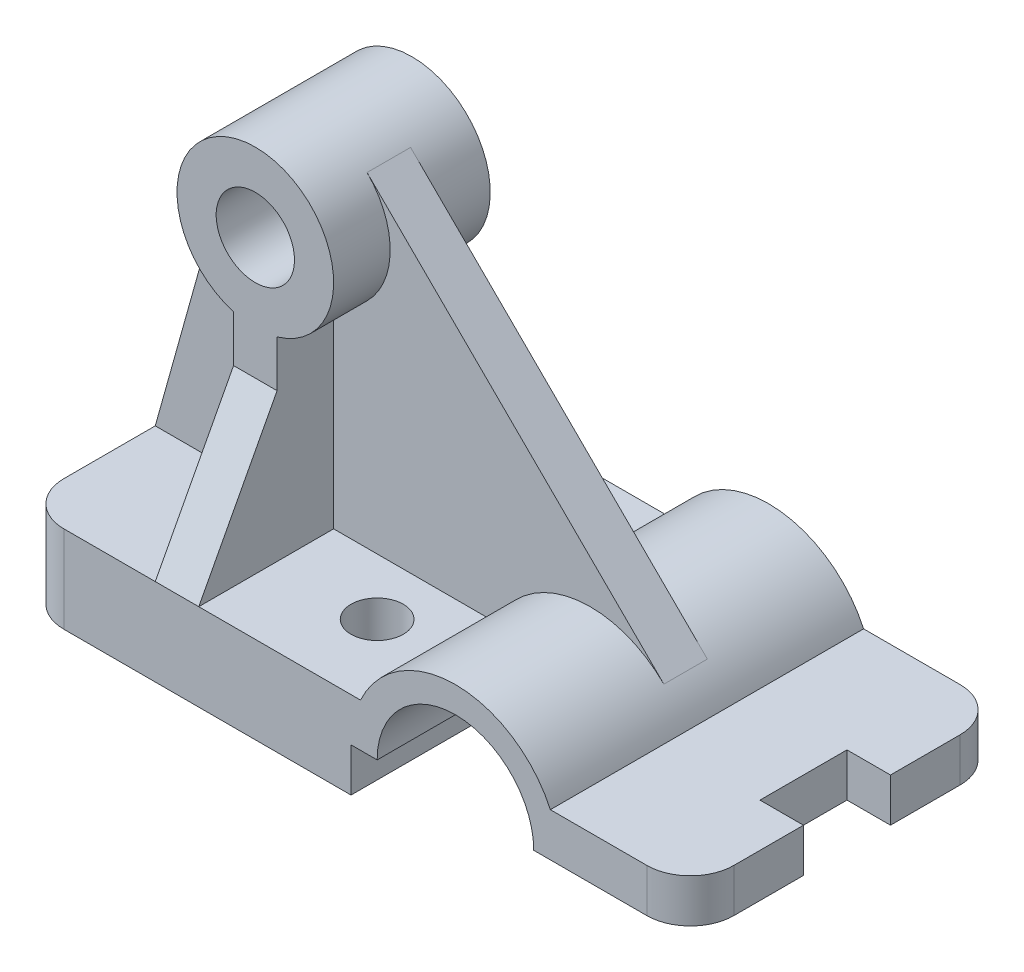
ISO-10303-21;
HEADER;
FILE_DESCRIPTION(('STEP AP214'),'2;1');
FILE_NAME('part.step','',(''),(''),'','','');
FILE_SCHEMA(('AUTOMOTIVE_DESIGN { 1 0 10303 214 1 1 1 1 }'));
ENDSEC;
DATA;
#1=APPLICATION_CONTEXT('core data for automotive mechanical design processes');
#2=APPLICATION_PROTOCOL_DEFINITION('international standard','automotive_design',2000,#1);
#3=PRODUCT_CONTEXT('',#1,'mechanical');
#4=PRODUCT('Part','Part','',(#3));
#5=PRODUCT_RELATED_PRODUCT_CATEGORY('part','',(#4));
#6=PRODUCT_DEFINITION_FORMATION('','',#4);
#7=PRODUCT_DEFINITION_CONTEXT('part definition',#1,'design');
#8=PRODUCT_DEFINITION('design','',#6,#7);
#9=PRODUCT_DEFINITION_SHAPE('','',#8);
#10=(LENGTH_UNIT() NAMED_UNIT(*) SI_UNIT(.MILLI.,.METRE.));
#11=(NAMED_UNIT(*) PLANE_ANGLE_UNIT() SI_UNIT($,.RADIAN.));
#12=(NAMED_UNIT(*) SI_UNIT($,.STERADIAN.) SOLID_ANGLE_UNIT());
#13=UNCERTAINTY_MEASURE_WITH_UNIT(LENGTH_MEASURE(1.E-05),#10,'distance_accuracy_value','');
#14=(GEOMETRIC_REPRESENTATION_CONTEXT(3) GLOBAL_UNCERTAINTY_ASSIGNED_CONTEXT((#13)) GLOBAL_UNIT_ASSIGNED_CONTEXT((#10,
#11,#12)) REPRESENTATION_CONTEXT('',''));
#15=CARTESIAN_POINT('',(0.,0.,0.));
#16=DIRECTION('',(0.,0.,1.));
#17=DIRECTION('',(1.,0.,0.));
#18=AXIS2_PLACEMENT_3D('',#15,#16,#17);
#19=CARTESIAN_POINT('',(31.,0.,0.));
#20=DIRECTION('',(1.,0.,0.));
#21=DIRECTION('',(0.,0.,-1.));
#22=AXIS2_PLACEMENT_3D('',#19,#20,#21);
#23=PLANE('',#22);
#24=DIRECTION('',(0.,-1.,0.));
#25=VECTOR('',#24,1.);
#26=CARTESIAN_POINT('',(31.,0.,31.));
#27=LINE('',#26,#25);
#28=CARTESIAN_POINT('',(31.,64.7083835342094,31.));
#29=VERTEX_POINT('',#28);
#30=CARTESIAN_POINT('',(31.,20.,31.));
#31=VERTEX_POINT('',#30);
#32=EDGE_CURVE('E264',#29,#31,#27,.T.);
#33=ORIENTED_EDGE('',*,*,#32,.F.);
#34=DIRECTION('',(0.,0.,-1.));
#35=VECTOR('',#34,1.);
#36=CARTESIAN_POINT('',(31.,64.7083835342094,54.));
#37=LINE('',#36,#35);
#38=CARTESIAN_POINT('',(31.,64.7083835342094,18.));
#39=VERTEX_POINT('',#38);
#40=EDGE_CURVE('E249',#39,#29,#37,.F.);
#41=ORIENTED_EDGE('',*,*,#40,.F.);
#42=DIRECTION('',(0.,1.,0.));
#43=VECTOR('',#42,1.);
#44=CARTESIAN_POINT('',(31.,54.,18.));
#45=LINE('',#44,#43);
#46=CARTESIAN_POINT('',(31.,54.,18.));
#47=VERTEX_POINT('',#46);
#48=EDGE_CURVE('E354',#47,#39,#45,.T.);
#49=ORIENTED_EDGE('',*,*,#48,.F.);
#50=DIRECTION('',(0.,-0.883787916347062,-0.467887720419033));
#51=VECTOR('',#50,1.);
#52=CARTESIAN_POINT('',(31.,54.,18.));
#53=LINE('',#52,#51);
#54=CARTESIAN_POINT('',(31.,20.,0.));
#55=VERTEX_POINT('',#54);
#56=EDGE_CURVE('E352',#47,#55,#53,.T.);
#57=ORIENTED_EDGE('',*,*,#56,.T.);
#58=DIRECTION('',(0.,0.,-1.));
#59=VECTOR('',#58,1.);
#60=CARTESIAN_POINT('',(31.,20.,72.));
#61=LINE('',#60,#59);
#62=EDGE_CURVE('E266',#31,#55,#61,.T.);
#63=ORIENTED_EDGE('',*,*,#62,.F.);
#64=EDGE_LOOP('',(#33,#41,#49,#57,#63));
#65=FACE_BOUND('',#64,.T.);
#66=ADVANCED_FACE('F33',(#65),#23,.F.);
#67=CARTESIAN_POINT('',(0.,20.,72.));
#68=DIRECTION('',(0.,-1.,0.));
#69=DIRECTION('',(1.,0.,0.));
#70=AXIS2_PLACEMENT_3D('',#67,#68,#69);
#71=PLANE('',#70);
#72=DIRECTION('',(-1.,0.,0.));
#73=VECTOR('',#72,1.);
#74=CARTESIAN_POINT('',(0.,20.,31.));
#75=LINE('',#74,#73);
#76=CARTESIAN_POINT('',(0.,20.,31.));
#77=VERTEX_POINT('',#76);
#78=EDGE_CURVE('E49',#31,#77,#75,.T.);
#79=ORIENTED_EDGE('',*,*,#78,.F.);
#80=ORIENTED_EDGE('',*,*,#62,.T.);
#81=DIRECTION('',(-1.,0.,0.));
#82=VECTOR('',#81,1.);
#83=CARTESIAN_POINT('',(0.,20.,0.));
#84=LINE('',#83,#82);
#85=CARTESIAN_POINT('',(10.,20.,0.));
#86=VERTEX_POINT('',#85);
#87=EDGE_CURVE('E434',#55,#86,#84,.T.);
#88=ORIENTED_EDGE('',*,*,#87,.T.);
#89=CARTESIAN_POINT('',(10.,20.,10.));
#90=DIRECTION('',(0.,-1.,0.));
#91=DIRECTION('',(1.,0.,0.));
#92=AXIS2_PLACEMENT_3D('',#89,#90,#91);
#93=CIRCLE('',#92,10.);
#94=CARTESIAN_POINT('',(0.,20.,10.));
#95=VERTEX_POINT('',#94);
#96=EDGE_CURVE('E498',#86,#95,#93,.F.);
#97=ORIENTED_EDGE('',*,*,#96,.T.);
#98=DIRECTION('',(0.,0.,-1.));
#99=VECTOR('',#98,1.);
#100=CARTESIAN_POINT('',(0.,20.,72.));
#101=LINE('',#100,#99);
#102=EDGE_CURVE('E413',#77,#95,#101,.T.);
#103=ORIENTED_EDGE('',*,*,#102,.F.);
#104=EDGE_LOOP('',(#79,#80,#88,#97,#103));
#105=FACE_BOUND('',#104,.T.);
#106=ADVANCED_FACE('F575',(#105),#71,.F.);
#107=CARTESIAN_POINT('',(41.,0.,0.));
#108=DIRECTION('',(1.,0.,0.));
#109=DIRECTION('',(0.,0.,-1.));
#110=AXIS2_PLACEMENT_3D('',#107,#108,#109);
#111=PLANE('',#110);
#112=DIRECTION('',(0.,0.,-1.));
#113=VECTOR('',#112,1.);
#114=CARTESIAN_POINT('',(41.,64.7083835342094,54.));
#115=LINE('',#114,#113);
#116=CARTESIAN_POINT('',(41.,64.7083835342094,18.));
#117=VERTEX_POINT('',#116);
#118=CARTESIAN_POINT('',(41.,64.7083835342094,31.));
#119=VERTEX_POINT('',#118);
#120=EDGE_CURVE('E327',#117,#119,#115,.F.);
#121=ORIENTED_EDGE('',*,*,#120,.T.);
#122=DIRECTION('',(0.,-1.,0.));
#123=VECTOR('',#122,1.);
#124=CARTESIAN_POINT('',(41.,0.,31.));
#125=LINE('',#124,#123);
#126=CARTESIAN_POINT('',(41.,20.,31.));
#127=VERTEX_POINT('',#126);
#128=EDGE_CURVE('E297',#119,#127,#125,.T.);
#129=ORIENTED_EDGE('',*,*,#128,.T.);
#130=DIRECTION('',(0.,0.,-1.));
#131=VECTOR('',#130,1.);
#132=CARTESIAN_POINT('',(41.,20.,72.));
#133=LINE('',#132,#131);
#134=CARTESIAN_POINT('',(41.,20.,0.));
#135=VERTEX_POINT('',#134);
#136=EDGE_CURVE('E334',#127,#135,#133,.T.);
#137=ORIENTED_EDGE('',*,*,#136,.T.);
#138=DIRECTION('',(0.,-0.883787916347062,-0.467887720419033));
#139=VECTOR('',#138,1.);
#140=CARTESIAN_POINT('',(41.,54.,18.));
#141=LINE('',#140,#139);
#142=CARTESIAN_POINT('',(41.,54.,18.));
#143=VERTEX_POINT('',#142);
#144=EDGE_CURVE('E339',#143,#135,#141,.T.);
#145=ORIENTED_EDGE('',*,*,#144,.F.);
#146=DIRECTION('',(0.,1.,0.));
#147=VECTOR('',#146,1.);
#148=CARTESIAN_POINT('',(41.,54.,18.));
#149=LINE('',#148,#147);
#150=EDGE_CURVE('E342',#143,#117,#149,.T.);
#151=ORIENTED_EDGE('',*,*,#150,.T.);
#152=EDGE_LOOP('',(#121,#129,#137,#145,#151));
#153=FACE_BOUND('',#152,.T.);
#154=ADVANCED_FACE('F586',(#153),#111,.T.);
#155=CARTESIAN_POINT('',(64.,20.,18.));
#156=DIRECTION('',(0.,-1.,0.));
#157=DIRECTION('',(1.,0.,0.));
#158=AXIS2_PLACEMENT_3D('',#155,#156,#157);
#159=CIRCLE('',#158,6.);
#160=CARTESIAN_POINT('',(70.,20.,18.));
#161=VERTEX_POINT('',#160);
#162=EDGE_CURVE('E555',#161,#161,#159,.F.);
#163=ORIENTED_EDGE('',*,*,#162,.F.);
#164=EDGE_LOOP('',(#163));
#165=FACE_BOUND('',#164,.T.);
#166=DIRECTION('',(-1.,0.,0.));
#167=VECTOR('',#166,1.);
#168=CARTESIAN_POINT('',(0.,20.,31.));
#169=LINE('',#168,#167);
#170=CARTESIAN_POINT('',(78.1825757707286,20.,31.));
#171=VERTEX_POINT('',#170);
#172=EDGE_CURVE('E299',#171,#127,#169,.T.);
#173=ORIENTED_EDGE('',*,*,#172,.F.);
#174=DIRECTION('',(0.,0.,-1.));
#175=VECTOR('',#174,1.);
#176=CARTESIAN_POINT('',(78.1825757707286,20.,72.));
#177=LINE('',#176,#175);
#178=CARTESIAN_POINT('',(78.1825757707286,20.,0.));
#179=VERTEX_POINT('',#178);
#180=EDGE_CURVE('E440',#171,#179,#177,.T.);
#181=ORIENTED_EDGE('',*,*,#180,.T.);
#182=EDGE_CURVE('E396',#179,#135,#84,.T.);
#183=ORIENTED_EDGE('',*,*,#182,.T.);
#184=ORIENTED_EDGE('',*,*,#136,.F.);
#185=EDGE_LOOP('',(#173,#181,#183,#184));
#186=FACE_BOUND('',#185,.T.);
#187=ADVANCED_FACE('F587',(#165,#186),#71,.F.);
#188=DIRECTION('',(0.,-1.,0.));
#189=VECTOR('',#188,1.);
#190=CARTESIAN_POINT('',(41.,0.,41.));
#191=LINE('',#190,#189);
#192=CARTESIAN_POINT('',(41.,64.7083835342094,41.));
#193=VERTEX_POINT('',#192);
#194=CARTESIAN_POINT('',(41.,20.,41.));
#195=VERTEX_POINT('',#194);
#196=EDGE_CURVE('E307',#193,#195,#191,.T.);
#197=ORIENTED_EDGE('',*,*,#196,.F.);
#198=CARTESIAN_POINT('',(41.,64.7083835342094,54.));
#199=VERTEX_POINT('',#198);
#200=EDGE_CURVE('E325',#193,#199,#115,.F.);
#201=ORIENTED_EDGE('',*,*,#200,.T.);
#202=DIRECTION('',(0.,1.,0.));
#203=VECTOR('',#202,1.);
#204=CARTESIAN_POINT('',(41.,54.,54.));
#205=LINE('',#204,#203);
#206=CARTESIAN_POINT('',(41.,54.,54.));
#207=VERTEX_POINT('',#206);
#208=EDGE_CURVE('E344',#207,#199,#205,.T.);
#209=ORIENTED_EDGE('',*,*,#208,.F.);
#210=DIRECTION('',(0.,-0.883787916347062,0.467887720419033));
#211=VECTOR('',#210,1.);
#212=CARTESIAN_POINT('',(41.,54.,54.));
#213=LINE('',#212,#211);
#214=CARTESIAN_POINT('',(41.,20.,72.));
#215=VERTEX_POINT('',#214);
#216=EDGE_CURVE('E331',#207,#215,#213,.T.);
#217=ORIENTED_EDGE('',*,*,#216,.T.);
#218=EDGE_CURVE('E336',#215,#195,#133,.T.);
#219=ORIENTED_EDGE('',*,*,#218,.T.);
#220=EDGE_LOOP('',(#197,#201,#209,#217,#219));
#221=FACE_BOUND('',#220,.T.);
#222=ADVANCED_FACE('F528',(#221),#111,.T.);
#223=CARTESIAN_POINT('',(31.,64.7083835342094,41.));
#224=VERTEX_POINT('',#223);
#225=CARTESIAN_POINT('',(31.,64.7083835342094,54.));
#226=VERTEX_POINT('',#225);
#227=EDGE_CURVE('E261',#224,#226,#37,.F.);
#228=ORIENTED_EDGE('',*,*,#227,.F.);
#229=DIRECTION('',(0.,-1.,0.));
#230=VECTOR('',#229,1.);
#231=CARTESIAN_POINT('',(31.,0.,41.));
#232=LINE('',#231,#230);
#233=CARTESIAN_POINT('',(31.,20.,41.));
#234=VERTEX_POINT('',#233);
#235=EDGE_CURVE('E57',#224,#234,#232,.T.);
#236=ORIENTED_EDGE('',*,*,#235,.T.);
#237=CARTESIAN_POINT('',(31.,20.,72.));
#238=VERTEX_POINT('',#237);
#239=EDGE_CURVE('E350',#238,#234,#61,.T.);
#240=ORIENTED_EDGE('',*,*,#239,.F.);
#241=DIRECTION('',(0.,-0.883787916347062,0.467887720419033));
#242=VECTOR('',#241,1.);
#243=CARTESIAN_POINT('',(31.,54.,54.));
#244=LINE('',#243,#242);
#245=CARTESIAN_POINT('',(31.,54.,54.));
#246=VERTEX_POINT('',#245);
#247=EDGE_CURVE('E330',#246,#238,#244,.T.);
#248=ORIENTED_EDGE('',*,*,#247,.F.);
#249=DIRECTION('',(0.,1.,0.));
#250=VECTOR('',#249,1.);
#251=CARTESIAN_POINT('',(31.,54.,54.));
#252=LINE('',#251,#250);
#253=EDGE_CURVE('E335',#246,#226,#252,.T.);
#254=ORIENTED_EDGE('',*,*,#253,.T.);
#255=EDGE_LOOP('',(#228,#236,#240,#248,#254));
#256=FACE_BOUND('',#255,.T.);
#257=ADVANCED_FACE('F533',(#256),#23,.F.);
#258=ORIENTED_EDGE('',*,*,#239,.T.);
#259=DIRECTION('',(-1.,0.,0.));
#260=VECTOR('',#259,1.);
#261=CARTESIAN_POINT('',(0.,20.,41.));
#262=LINE('',#261,#260);
#263=CARTESIAN_POINT('',(0.,20.,41.));
#264=VERTEX_POINT('',#263);
#265=EDGE_CURVE('E283',#234,#264,#262,.T.);
#266=ORIENTED_EDGE('',*,*,#265,.T.);
#267=CARTESIAN_POINT('',(0.,20.,62.));
#268=VERTEX_POINT('',#267);
#269=EDGE_CURVE('E437',#268,#264,#101,.T.);
#270=ORIENTED_EDGE('',*,*,#269,.F.);
#271=CARTESIAN_POINT('',(9.99999999999999,20.,62.));
#272=DIRECTION('',(0.,-1.,0.));
#273=DIRECTION('',(1.,0.,0.));
#274=AXIS2_PLACEMENT_3D('',#271,#272,#273);
#275=CIRCLE('',#274,10.);
#276=CARTESIAN_POINT('',(9.99999999999999,20.,72.));
#277=VERTEX_POINT('',#276);
#278=EDGE_CURVE('E501',#268,#277,#275,.F.);
#279=ORIENTED_EDGE('',*,*,#278,.T.);
#280=DIRECTION('',(-1.,0.,0.));
#281=VECTOR('',#280,1.);
#282=CARTESIAN_POINT('',(0.,20.,72.));
#283=LINE('',#282,#281);
#284=EDGE_CURVE('E409',#238,#277,#283,.T.);
#285=ORIENTED_EDGE('',*,*,#284,.F.);
#286=EDGE_LOOP('',(#258,#266,#270,#279,#285));
#287=FACE_BOUND('',#286,.T.);
#288=ADVANCED_FACE('F546',(#287),#71,.F.);
#289=CARTESIAN_POINT('',(154.,10.,72.));
#290=DIRECTION('',(-1.,0.,0.));
#291=DIRECTION('',(0.,-1.,0.));
#292=AXIS2_PLACEMENT_3D('',#289,#290,#291);
#293=PLANE('',#292);
#294=DIRECTION('',(0.,0.,-1.));
#295=VECTOR('',#294,1.);
#296=CARTESIAN_POINT('',(154.,10.,72.));
#297=LINE('',#296,#295);
#298=CARTESIAN_POINT('',(154.,10.,62.));
#299=VERTEX_POINT('',#298);
#300=CARTESIAN_POINT('',(154.,10.,46.));
#301=VERTEX_POINT('',#300);
#302=EDGE_CURVE('E451',#299,#301,#297,.T.);
#303=ORIENTED_EDGE('',*,*,#302,.T.);
#304=DIRECTION('',(0.,1.,0.));
#305=VECTOR('',#304,1.);
#306=CARTESIAN_POINT('',(154.,-52.,46.));
#307=LINE('',#306,#305);
#308=CARTESIAN_POINT('',(154.,20.,46.));
#309=VERTEX_POINT('',#308);
#310=EDGE_CURVE('E375',#301,#309,#307,.T.);
#311=ORIENTED_EDGE('',*,*,#310,.T.);
#312=DIRECTION('',(0.,0.,-1.));
#313=VECTOR('',#312,1.);
#314=CARTESIAN_POINT('',(154.,20.,72.));
#315=LINE('',#314,#313);
#316=CARTESIAN_POINT('',(154.,20.,62.));
#317=VERTEX_POINT('',#316);
#318=EDGE_CURVE('E447',#317,#309,#315,.T.);
#319=ORIENTED_EDGE('',*,*,#318,.F.);
#320=DIRECTION('',(0.,1.,0.));
#321=VECTOR('',#320,1.);
#322=CARTESIAN_POINT('',(154.,10.,62.));
#323=LINE('',#322,#321);
#324=EDGE_CURVE('E464',#317,#299,#323,.F.);
#325=ORIENTED_EDGE('',*,*,#324,.T.);
#326=EDGE_LOOP('',(#303,#311,#319,#325));
#327=FACE_BOUND('',#326,.T.);
#328=ADVANCED_FACE('F589',(#327),#293,.F.);
#329=CARTESIAN_POINT('',(0.,0.,72.));
#330=DIRECTION('',(1.,0.,0.));
#331=DIRECTION('',(0.,0.,-1.));
#332=AXIS2_PLACEMENT_3D('',#329,#330,#331);
#333=PLANE('',#332);
#334=ORIENTED_EDGE('',*,*,#269,.T.);
#335=DIRECTION('',(0.,0.,-1.));
#336=VECTOR('',#335,1.);
#337=CARTESIAN_POINT('',(0.,20.,72.));
#338=LINE('',#337,#336);
#339=EDGE_CURVE('E285',#77,#264,#338,.F.);
#340=ORIENTED_EDGE('',*,*,#339,.F.);
#341=ORIENTED_EDGE('',*,*,#102,.T.);
#342=DIRECTION('',(0.,-1.,0.));
#343=VECTOR('',#342,1.);
#344=CARTESIAN_POINT('',(0.,0.,10.));
#345=LINE('',#344,#343);
#346=CARTESIAN_POINT('',(0.,0.,10.));
#347=VERTEX_POINT('',#346);
#348=EDGE_CURVE('E493',#95,#347,#345,.T.);
#349=ORIENTED_EDGE('',*,*,#348,.T.);
#350=DIRECTION('',(0.,0.,-1.));
#351=VECTOR('',#350,1.);
#352=CARTESIAN_POINT('',(0.,0.,72.));
#353=LINE('',#352,#351);
#354=CARTESIAN_POINT('',(0.,0.,62.));
#355=VERTEX_POINT('',#354);
#356=EDGE_CURVE('E462',#355,#347,#353,.T.);
#357=ORIENTED_EDGE('',*,*,#356,.F.);
#358=DIRECTION('',(0.,-1.,0.));
#359=VECTOR('',#358,1.);
#360=CARTESIAN_POINT('',(0.,20.,62.));
#361=LINE('',#360,#359);
#362=EDGE_CURVE('E496',#355,#268,#361,.F.);
#363=ORIENTED_EDGE('',*,*,#362,.T.);
#364=EDGE_LOOP('',(#334,#340,#341,#349,#357,#363));
#365=FACE_BOUND('',#364,.T.);
#366=ADVANCED_FACE('F550',(#365),#333,.F.);
#367=CARTESIAN_POINT('',(0.,0.,72.));
#368=DIRECTION('',(0.,1.,0.));
#369=DIRECTION('',(0.,0.,1.));
#370=AXIS2_PLACEMENT_3D('',#367,#368,#369);
#371=PLANE('',#370);
#372=CARTESIAN_POINT('',(64.,0.,54.));
#373=DIRECTION('',(0.,1.,0.));
#374=DIRECTION('',(0.,0.,1.));
#375=AXIS2_PLACEMENT_3D('',#372,#373,#374);
#376=CIRCLE('',#375,6.);
#377=CARTESIAN_POINT('',(64.,0.,60.));
#378=VERTEX_POINT('',#377);
#379=EDGE_CURVE('E564',#378,#378,#376,.T.);
#380=ORIENTED_EDGE('',*,*,#379,.T.);
#381=EDGE_LOOP('',(#380));
#382=FACE_BOUND('',#381,.T.);
#383=CARTESIAN_POINT('',(64.,0.,18.));
#384=DIRECTION('',(0.,1.,0.));
#385=DIRECTION('',(0.,0.,1.));
#386=AXIS2_PLACEMENT_3D('',#383,#384,#385);
#387=CIRCLE('',#386,6.);
#388=CARTESIAN_POINT('',(64.,0.,24.));
#389=VERTEX_POINT('',#388);
#390=EDGE_CURVE('E557',#389,#389,#387,.T.);
#391=ORIENTED_EDGE('',*,*,#390,.T.);
#392=EDGE_LOOP('',(#391));
#393=FACE_BOUND('',#392,.T.);
#394=ORIENTED_EDGE('',*,*,#356,.T.);
#395=CARTESIAN_POINT('',(10.,0.,10.));
#396=DIRECTION('',(0.,1.,0.));
#397=DIRECTION('',(0.,0.,1.));
#398=AXIS2_PLACEMENT_3D('',#395,#396,#397);
#399=CIRCLE('',#398,10.);
#400=CARTESIAN_POINT('',(10.,0.,0.));
#401=VERTEX_POINT('',#400);
#402=EDGE_CURVE('E489',#347,#401,#399,.F.);
#403=ORIENTED_EDGE('',*,*,#402,.T.);
#404=DIRECTION('',(1.,0.,0.));
#405=VECTOR('',#404,1.);
#406=CARTESIAN_POINT('',(0.,0.,0.));
#407=LINE('',#406,#405);
#408=CARTESIAN_POINT('',(76.,0.,0.));
#409=VERTEX_POINT('',#408);
#410=EDGE_CURVE('E392',#401,#409,#407,.T.);
#411=ORIENTED_EDGE('',*,*,#410,.T.);
#412=DIRECTION('',(0.,0.,-1.));
#413=VECTOR('',#412,1.);
#414=CARTESIAN_POINT('',(76.,0.,72.));
#415=LINE('',#414,#413);
#416=CARTESIAN_POINT('',(76.,0.,72.));
#417=VERTEX_POINT('',#416);
#418=EDGE_CURVE('E460',#417,#409,#415,.T.);
#419=ORIENTED_EDGE('',*,*,#418,.F.);
#420=DIRECTION('',(1.,0.,0.));
#421=VECTOR('',#420,1.);
#422=CARTESIAN_POINT('',(0.,0.,72.));
#423=LINE('',#422,#421);
#424=CARTESIAN_POINT('',(9.99999999999999,0.,72.));
#425=VERTEX_POINT('',#424);
#426=EDGE_CURVE('E393',#425,#417,#423,.T.);
#427=ORIENTED_EDGE('',*,*,#426,.F.);
#428=CARTESIAN_POINT('',(9.99999999999999,0.,62.));
#429=DIRECTION('',(0.,1.,0.));
#430=DIRECTION('',(0.,0.,1.));
#431=AXIS2_PLACEMENT_3D('',#428,#429,#430);
#432=CIRCLE('',#431,10.);
#433=EDGE_CURVE('E491',#425,#355,#432,.F.);
#434=ORIENTED_EDGE('',*,*,#433,.T.);
#435=EDGE_LOOP('',(#394,#403,#411,#419,#427,#434));
#436=FACE_BOUND('',#435,.T.);
#437=ADVANCED_FACE('F838',(#382,#393,#436),#371,.F.);
#438=CARTESIAN_POINT('',(76.,0.,72.));
#439=DIRECTION('',(-1.,0.,0.));
#440=DIRECTION('',(0.,0.,1.));
#441=AXIS2_PLACEMENT_3D('',#438,#439,#440);
#442=PLANE('',#441);
#443=ORIENTED_EDGE('',*,*,#418,.T.);
#444=DIRECTION('',(0.,1.,0.));
#445=VECTOR('',#444,1.);
#446=CARTESIAN_POINT('',(76.,0.,0.));
#447=LINE('',#446,#445);
#448=CARTESIAN_POINT('',(76.,10.,0.));
#449=VERTEX_POINT('',#448);
#450=EDGE_CURVE('E416',#409,#449,#447,.T.);
#451=ORIENTED_EDGE('',*,*,#450,.T.);
#452=DIRECTION('',(0.,0.,-1.));
#453=VECTOR('',#452,1.);
#454=CARTESIAN_POINT('',(76.,10.,72.));
#455=LINE('',#454,#453);
#456=CARTESIAN_POINT('',(76.,10.,72.));
#457=VERTEX_POINT('',#456);
#458=EDGE_CURVE('E458',#457,#449,#455,.T.);
#459=ORIENTED_EDGE('',*,*,#458,.F.);
#460=DIRECTION('',(0.,1.,0.));
#461=VECTOR('',#460,1.);
#462=CARTESIAN_POINT('',(76.,0.,72.));
#463=LINE('',#462,#461);
#464=EDGE_CURVE('E395',#417,#457,#463,.T.);
#465=ORIENTED_EDGE('',*,*,#464,.F.);
#466=EDGE_LOOP('',(#443,#451,#459,#465));
#467=FACE_BOUND('',#466,.T.);
#468=ADVANCED_FACE('F841',(#467),#442,.F.);
#469=CARTESIAN_POINT('',(76.,10.,72.));
#470=DIRECTION('',(0.,1.,0.));
#471=DIRECTION('',(0.,0.,1.));
#472=AXIS2_PLACEMENT_3D('',#469,#470,#471);
#473=PLANE('',#472);
#474=ORIENTED_EDGE('',*,*,#458,.T.);
#475=DIRECTION('',(1.,0.,0.));
#476=VECTOR('',#475,1.);
#477=CARTESIAN_POINT('',(76.,10.,0.));
#478=LINE('',#477,#476);
#479=CARTESIAN_POINT('',(82.,10.,0.));
#480=VERTEX_POINT('',#479);
#481=EDGE_CURVE('E419',#449,#480,#478,.T.);
#482=ORIENTED_EDGE('',*,*,#481,.T.);
#483=DIRECTION('',(0.,0.,-1.));
#484=VECTOR('',#483,1.);
#485=CARTESIAN_POINT('',(82.,10.,72.));
#486=LINE('',#485,#484);
#487=CARTESIAN_POINT('',(82.,10.,72.));
#488=VERTEX_POINT('',#487);
#489=EDGE_CURVE('E456',#488,#480,#486,.T.);
#490=ORIENTED_EDGE('',*,*,#489,.F.);
#491=DIRECTION('',(1.,0.,0.));
#492=VECTOR('',#491,1.);
#493=CARTESIAN_POINT('',(76.,10.,72.));
#494=LINE('',#493,#492);
#495=EDGE_CURVE('E398',#457,#488,#494,.T.);
#496=ORIENTED_EDGE('',*,*,#495,.F.);
#497=EDGE_LOOP('',(#474,#482,#490,#496));
#498=FACE_BOUND('',#497,.T.);
#499=ADVANCED_FACE('F844',(#498),#473,.F.);
#500=CARTESIAN_POINT('',(100.,10.,72.));
#501=DIRECTION('',(0.,0.,-1.));
#502=DIRECTION('',(-1.,0.,0.));
#503=AXIS2_PLACEMENT_3D('',#500,#501,#502);
#504=CYLINDRICAL_SURFACE('',#503,18.);
#505=ORIENTED_EDGE('',*,*,#489,.T.);
#506=CARTESIAN_POINT('',(100.,10.,0.));
#507=DIRECTION('',(0.,0.,-1.));
#508=DIRECTION('',(-1.,0.,0.));
#509=AXIS2_PLACEMENT_3D('',#506,#507,#508);
#510=CIRCLE('',#509,18.);
#511=CARTESIAN_POINT('',(118.,10.,0.));
#512=VERTEX_POINT('',#511);
#513=EDGE_CURVE('E422',#480,#512,#510,.T.);
#514=ORIENTED_EDGE('',*,*,#513,.T.);
#515=DIRECTION('',(0.,0.,-1.));
#516=VECTOR('',#515,1.);
#517=CARTESIAN_POINT('',(118.,10.,72.));
#518=LINE('',#517,#516);
#519=CARTESIAN_POINT('',(118.,10.,72.));
#520=VERTEX_POINT('',#519);
#521=EDGE_CURVE('E454',#520,#512,#518,.T.);
#522=ORIENTED_EDGE('',*,*,#521,.F.);
#523=CARTESIAN_POINT('',(100.,10.,72.));
#524=DIRECTION('',(0.,0.,-1.));
#525=DIRECTION('',(-1.,0.,0.));
#526=AXIS2_PLACEMENT_3D('',#523,#524,#525);
#527=CIRCLE('',#526,18.);
#528=EDGE_CURVE('E400',#488,#520,#527,.T.);
#529=ORIENTED_EDGE('',*,*,#528,.F.);
#530=EDGE_LOOP('',(#505,#514,#522,#529));
#531=FACE_BOUND('',#530,.T.);
#532=ADVANCED_FACE('F848',(#531),#504,.F.);
#533=CARTESIAN_POINT('',(118.,10.,72.));
#534=DIRECTION('',(0.,1.,0.));
#535=DIRECTION('',(-1.,0.,0.));
#536=AXIS2_PLACEMENT_3D('',#533,#534,#535);
#537=PLANE('',#536);
#538=ORIENTED_EDGE('',*,*,#521,.T.);
#539=DIRECTION('',(1.,0.,0.));
#540=VECTOR('',#539,1.);
#541=CARTESIAN_POINT('',(118.,10.,0.));
#542=LINE('',#541,#540);
#543=CARTESIAN_POINT('',(144.,10.,0.));
#544=VERTEX_POINT('',#543);
#545=EDGE_CURVE('E425',#512,#544,#542,.T.);
#546=ORIENTED_EDGE('',*,*,#545,.T.);
#547=CARTESIAN_POINT('',(144.,10.,10.));
#548=DIRECTION('',(0.,1.,0.));
#549=DIRECTION('',(-1.,0.,0.));
#550=AXIS2_PLACEMENT_3D('',#547,#548,#549);
#551=CIRCLE('',#550,10.);
#552=CARTESIAN_POINT('',(154.,10.,10.));
#553=VERTEX_POINT('',#552);
#554=EDGE_CURVE('E480',#544,#553,#551,.F.);
#555=ORIENTED_EDGE('',*,*,#554,.T.);
#556=CARTESIAN_POINT('',(154.,10.,26.));
#557=VERTEX_POINT('',#556);
#558=EDGE_CURVE('E450',#557,#553,#297,.T.);
#559=ORIENTED_EDGE('',*,*,#558,.F.);
#560=DIRECTION('',(-1.,0.,0.));
#561=VECTOR('',#560,1.);
#562=CARTESIAN_POINT('',(118.,10.,26.));
#563=LINE('',#562,#561);
#564=CARTESIAN_POINT('',(144.,10.,26.));
#565=VERTEX_POINT('',#564);
#566=EDGE_CURVE('E378',#557,#565,#563,.T.);
#567=ORIENTED_EDGE('',*,*,#566,.T.);
#568=DIRECTION('',(0.,0.,1.));
#569=VECTOR('',#568,1.);
#570=CARTESIAN_POINT('',(144.,10.,72.));
#571=LINE('',#570,#569);
#572=CARTESIAN_POINT('',(144.,10.,46.));
#573=VERTEX_POINT('',#572);
#574=EDGE_CURVE('E387',#565,#573,#571,.T.);
#575=ORIENTED_EDGE('',*,*,#574,.T.);
#576=DIRECTION('',(1.,0.,0.));
#577=VECTOR('',#576,1.);
#578=CARTESIAN_POINT('',(118.,10.,46.));
#579=LINE('',#578,#577);
#580=EDGE_CURVE('E389',#573,#301,#579,.T.);
#581=ORIENTED_EDGE('',*,*,#580,.T.);
#582=ORIENTED_EDGE('',*,*,#302,.F.);
#583=CARTESIAN_POINT('',(144.,10.,62.));
#584=DIRECTION('',(0.,1.,0.));
#585=DIRECTION('',(-1.,0.,0.));
#586=AXIS2_PLACEMENT_3D('',#583,#584,#585);
#587=CIRCLE('',#586,10.);
#588=CARTESIAN_POINT('',(144.,10.,72.));
#589=VERTEX_POINT('',#588);
#590=EDGE_CURVE('E478',#299,#589,#587,.F.);
#591=ORIENTED_EDGE('',*,*,#590,.T.);
#592=DIRECTION('',(1.,0.,0.));
#593=VECTOR('',#592,1.);
#594=CARTESIAN_POINT('',(118.,10.,72.));
#595=LINE('',#594,#593);
#596=EDGE_CURVE('E402',#520,#589,#595,.T.);
#597=ORIENTED_EDGE('',*,*,#596,.F.);
#598=EDGE_LOOP('',(#538,#546,#555,#559,#567,#575,#581,#582,#591,#597));
#599=FACE_BOUND('',#598,.T.);
#600=ADVANCED_FACE('F785',(#599),#537,.F.);
#601=CARTESIAN_POINT('',(154.,20.,26.));
#602=VERTEX_POINT('',#601);
#603=CARTESIAN_POINT('',(154.,20.,10.));
#604=VERTEX_POINT('',#603);
#605=EDGE_CURVE('E446',#602,#604,#315,.T.);
#606=ORIENTED_EDGE('',*,*,#605,.F.);
#607=DIRECTION('',(0.,1.,0.));
#608=VECTOR('',#607,1.);
#609=CARTESIAN_POINT('',(154.,-52.,26.));
#610=LINE('',#609,#608);
#611=EDGE_CURVE('E374',#557,#602,#610,.T.);
#612=ORIENTED_EDGE('',*,*,#611,.F.);
#613=ORIENTED_EDGE('',*,*,#558,.T.);
#614=DIRECTION('',(0.,1.,0.));
#615=VECTOR('',#614,1.);
#616=CARTESIAN_POINT('',(154.,10.,10.));
#617=LINE('',#616,#615);
#618=EDGE_CURVE('E466',#553,#604,#617,.T.);
#619=ORIENTED_EDGE('',*,*,#618,.T.);
#620=EDGE_LOOP('',(#606,#612,#613,#619));
#621=FACE_BOUND('',#620,.T.);
#622=ADVANCED_FACE('F780',(#621),#293,.F.);
#623=CARTESIAN_POINT('',(154.,20.,72.));
#624=DIRECTION('',(0.,-1.,0.));
#625=DIRECTION('',(1.,0.,0.));
#626=AXIS2_PLACEMENT_3D('',#623,#624,#625);
#627=PLANE('',#626);
#628=DIRECTION('',(1.,0.,0.));
#629=VECTOR('',#628,1.);
#630=CARTESIAN_POINT('',(154.,20.,46.));
#631=LINE('',#630,#629);
#632=CARTESIAN_POINT('',(144.,20.,46.));
#633=VERTEX_POINT('',#632);
#634=EDGE_CURVE('E372',#633,#309,#631,.T.);
#635=ORIENTED_EDGE('',*,*,#634,.F.);
#636=DIRECTION('',(0.,0.,1.));
#637=VECTOR('',#636,1.);
#638=CARTESIAN_POINT('',(144.,20.,26.));
#639=LINE('',#638,#637);
#640=CARTESIAN_POINT('',(144.,20.,26.));
#641=VERTEX_POINT('',#640);
#642=EDGE_CURVE('E370',#641,#633,#639,.T.);
#643=ORIENTED_EDGE('',*,*,#642,.F.);
#644=DIRECTION('',(-1.,0.,0.));
#645=VECTOR('',#644,1.);
#646=CARTESIAN_POINT('',(154.,20.,26.));
#647=LINE('',#646,#645);
#648=EDGE_CURVE('E367',#602,#641,#647,.T.);
#649=ORIENTED_EDGE('',*,*,#648,.F.);
#650=ORIENTED_EDGE('',*,*,#605,.T.);
#651=CARTESIAN_POINT('',(144.,20.,10.));
#652=DIRECTION('',(0.,-1.,0.));
#653=DIRECTION('',(1.,0.,0.));
#654=AXIS2_PLACEMENT_3D('',#651,#652,#653);
#655=CIRCLE('',#654,10.);
#656=CARTESIAN_POINT('',(144.,20.,0.));
#657=VERTEX_POINT('',#656);
#658=EDGE_CURVE('E471',#604,#657,#655,.F.);
#659=ORIENTED_EDGE('',*,*,#658,.T.);
#660=DIRECTION('',(-1.,0.,0.));
#661=VECTOR('',#660,1.);
#662=CARTESIAN_POINT('',(154.,20.,0.));
#663=LINE('',#662,#661);
#664=CARTESIAN_POINT('',(121.817424229271,20.,0.));
#665=VERTEX_POINT('',#664);
#666=EDGE_CURVE('E428',#657,#665,#663,.T.);
#667=ORIENTED_EDGE('',*,*,#666,.T.);
#668=DIRECTION('',(0.,0.,-1.));
#669=VECTOR('',#668,1.);
#670=CARTESIAN_POINT('',(121.817424229271,20.,72.));
#671=LINE('',#670,#669);
#672=CARTESIAN_POINT('',(121.817424229271,20.,72.));
#673=VERTEX_POINT('',#672);
#674=EDGE_CURVE('E444',#673,#665,#671,.T.);
#675=ORIENTED_EDGE('',*,*,#674,.F.);
#676=DIRECTION('',(-1.,0.,0.));
#677=VECTOR('',#676,1.);
#678=CARTESIAN_POINT('',(154.,20.,72.));
#679=LINE('',#678,#677);
#680=CARTESIAN_POINT('',(144.,20.,72.));
#681=VERTEX_POINT('',#680);
#682=EDGE_CURVE('E405',#681,#673,#679,.T.);
#683=ORIENTED_EDGE('',*,*,#682,.F.);
#684=CARTESIAN_POINT('',(144.,20.,62.));
#685=DIRECTION('',(0.,-1.,0.));
#686=DIRECTION('',(1.,0.,0.));
#687=AXIS2_PLACEMENT_3D('',#684,#685,#686);
#688=CIRCLE('',#687,10.);
#689=EDGE_CURVE('E469',#681,#317,#688,.F.);
#690=ORIENTED_EDGE('',*,*,#689,.T.);
#691=ORIENTED_EDGE('',*,*,#318,.T.);
#692=EDGE_LOOP('',(#635,#643,#649,#650,#659,#667,#675,#683,#690,#691));
#693=FACE_BOUND('',#692,.T.);
#694=ADVANCED_FACE('F582',(#693),#627,.F.);
#695=CARTESIAN_POINT('',(100.,10.,72.));
#696=DIRECTION('',(0.,0.,-1.));
#697=DIRECTION('',(-1.,0.,0.));
#698=AXIS2_PLACEMENT_3D('',#695,#696,#697);
#699=CYLINDRICAL_SURFACE('',#698,24.);
#700=ORIENTED_EDGE('',*,*,#674,.T.);
#701=CARTESIAN_POINT('',(100.,10.,0.));
#702=DIRECTION('',(0.,0.,1.));
#703=DIRECTION('',(1.,0.,0.));
#704=AXIS2_PLACEMENT_3D('',#701,#702,#703);
#705=CIRCLE('',#704,24.);
#706=EDGE_CURVE('E431',#665,#179,#705,.T.);
#707=ORIENTED_EDGE('',*,*,#706,.T.);
#708=ORIENTED_EDGE('',*,*,#180,.F.);
#709=CARTESIAN_POINT('',(100.,10.,31.));
#710=DIRECTION('',(0.,0.,1.));
#711=DIRECTION('',(1.,0.,0.));
#712=AXIS2_PLACEMENT_3D('',#709,#710,#711);
#713=CIRCLE('',#712,24.);
#714=CARTESIAN_POINT('',(116.909893198703,27.0310161766249,31.));
#715=VERTEX_POINT('',#714);
#716=EDGE_CURVE('E302',#715,#171,#713,.T.);
#717=ORIENTED_EDGE('',*,*,#716,.F.);
#718=DIRECTION('',(0.,0.,-1.));
#719=VECTOR('',#718,1.);
#720=CARTESIAN_POINT('',(116.909893198703,27.0310161766249,72.));
#721=LINE('',#720,#719);
#722=CARTESIAN_POINT('',(116.909893198703,27.0310161766249,41.));
#723=VERTEX_POINT('',#722);
#724=EDGE_CURVE('E314',#715,#723,#721,.F.);
#725=ORIENTED_EDGE('',*,*,#724,.T.);
#726=CARTESIAN_POINT('',(100.,10.,41.));
#727=DIRECTION('',(0.,0.,1.));
#728=DIRECTION('',(1.,0.,0.));
#729=AXIS2_PLACEMENT_3D('',#726,#727,#728);
#730=CIRCLE('',#729,24.);
#731=CARTESIAN_POINT('',(78.1825757707286,20.,41.));
#732=VERTEX_POINT('',#731);
#733=EDGE_CURVE('E312',#723,#732,#730,.T.);
#734=ORIENTED_EDGE('',*,*,#733,.T.);
#735=CARTESIAN_POINT('',(78.1825757707286,20.,72.));
#736=VERTEX_POINT('',#735);
#737=EDGE_CURVE('E441',#736,#732,#177,.T.);
#738=ORIENTED_EDGE('',*,*,#737,.F.);
#739=CARTESIAN_POINT('',(100.,10.,72.));
#740=DIRECTION('',(0.,0.,1.));
#741=DIRECTION('',(1.,0.,0.));
#742=AXIS2_PLACEMENT_3D('',#739,#740,#741);
#743=CIRCLE('',#742,24.);
#744=EDGE_CURVE('E407',#673,#736,#743,.T.);
#745=ORIENTED_EDGE('',*,*,#744,.F.);
#746=EDGE_LOOP('',(#700,#707,#708,#717,#725,#734,#738,#745));
#747=FACE_BOUND('',#746,.T.);
#748=ADVANCED_FACE('F517',(#747),#699,.T.);
#749=CARTESIAN_POINT('',(64.,20.,54.));
#750=DIRECTION('',(0.,-1.,0.));
#751=DIRECTION('',(1.,0.,0.));
#752=AXIS2_PLACEMENT_3D('',#749,#750,#751);
#753=CIRCLE('',#752,6.);
#754=CARTESIAN_POINT('',(70.,20.,54.));
#755=VERTEX_POINT('',#754);
#756=EDGE_CURVE('E37',#755,#755,#753,.F.);
#757=ORIENTED_EDGE('',*,*,#756,.F.);
#758=EDGE_LOOP('',(#757));
#759=FACE_BOUND('',#758,.T.);
#760=ORIENTED_EDGE('',*,*,#737,.T.);
#761=DIRECTION('',(-1.,0.,0.));
#762=VECTOR('',#761,1.);
#763=CARTESIAN_POINT('',(0.,20.,41.));
#764=LINE('',#763,#762);
#765=EDGE_CURVE('E310',#732,#195,#764,.T.);
#766=ORIENTED_EDGE('',*,*,#765,.T.);
#767=ORIENTED_EDGE('',*,*,#218,.F.);
#768=EDGE_CURVE('E410',#736,#215,#283,.T.);
#769=ORIENTED_EDGE('',*,*,#768,.F.);
#770=EDGE_LOOP('',(#760,#766,#767,#769));
#771=FACE_BOUND('',#770,.T.);
#772=ADVANCED_FACE('F521',(#759,#771),#71,.F.);
#773=CARTESIAN_POINT('',(100.,10.,72.));
#774=DIRECTION('',(0.,0.,1.));
#775=DIRECTION('',(1.,0.,0.));
#776=AXIS2_PLACEMENT_3D('',#773,#774,#775);
#777=PLANE('',#776);
#778=ORIENTED_EDGE('',*,*,#596,.T.);
#779=DIRECTION('',(0.,1.,0.));
#780=VECTOR('',#779,1.);
#781=CARTESIAN_POINT('',(144.,20.,72.));
#782=LINE('',#781,#780);
#783=EDGE_CURVE('E486',#589,#681,#782,.T.);
#784=ORIENTED_EDGE('',*,*,#783,.T.);
#785=ORIENTED_EDGE('',*,*,#682,.T.);
#786=ORIENTED_EDGE('',*,*,#744,.T.);
#787=ORIENTED_EDGE('',*,*,#768,.T.);
#788=DIRECTION('',(-1.,0.,0.));
#789=VECTOR('',#788,1.);
#790=CARTESIAN_POINT('',(41.,20.,72.));
#791=LINE('',#790,#789);
#792=EDGE_CURVE('E364',#215,#238,#791,.T.);
#793=ORIENTED_EDGE('',*,*,#792,.T.);
#794=ORIENTED_EDGE('',*,*,#284,.T.);
#795=DIRECTION('',(0.,-1.,0.));
#796=VECTOR('',#795,1.);
#797=CARTESIAN_POINT('',(9.99999999999999,0.,72.));
#798=LINE('',#797,#796);
#799=EDGE_CURVE('E483',#277,#425,#798,.T.);
#800=ORIENTED_EDGE('',*,*,#799,.T.);
#801=ORIENTED_EDGE('',*,*,#426,.T.);
#802=ORIENTED_EDGE('',*,*,#464,.T.);
#803=ORIENTED_EDGE('',*,*,#495,.T.);
#804=ORIENTED_EDGE('',*,*,#528,.T.);
#805=EDGE_LOOP('',(#778,#784,#785,#786,#787,#793,#794,#800,#801,#802,#803,#804));
#806=FACE_BOUND('',#805,.T.);
#807=ADVANCED_FACE('F523',(#806),#777,.T.);
#808=CARTESIAN_POINT('',(100.,10.,0.));
#809=DIRECTION('',(0.,0.,1.));
#810=DIRECTION('',(1.,0.,0.));
#811=AXIS2_PLACEMENT_3D('',#808,#809,#810);
#812=PLANE('',#811);
#813=ORIENTED_EDGE('',*,*,#666,.F.);
#814=DIRECTION('',(0.,1.,0.));
#815=VECTOR('',#814,1.);
#816=CARTESIAN_POINT('',(144.,9.99999999999988,0.));
#817=LINE('',#816,#815);
#818=EDGE_CURVE('E476',#657,#544,#817,.F.);
#819=ORIENTED_EDGE('',*,*,#818,.T.);
#820=ORIENTED_EDGE('',*,*,#545,.F.);
#821=ORIENTED_EDGE('',*,*,#513,.F.);
#822=ORIENTED_EDGE('',*,*,#481,.F.);
#823=ORIENTED_EDGE('',*,*,#450,.F.);
#824=ORIENTED_EDGE('',*,*,#410,.F.);
#825=DIRECTION('',(0.,-1.,0.));
#826=VECTOR('',#825,1.);
#827=CARTESIAN_POINT('',(9.99999999999999,10.,0.));
#828=LINE('',#827,#826);
#829=EDGE_CURVE('E473',#401,#86,#828,.F.);
#830=ORIENTED_EDGE('',*,*,#829,.T.);
#831=ORIENTED_EDGE('',*,*,#87,.F.);
#832=DIRECTION('',(-1.,0.,0.));
#833=VECTOR('',#832,1.);
#834=CARTESIAN_POINT('',(41.,20.,0.));
#835=LINE('',#834,#833);
#836=EDGE_CURVE('E361',#135,#55,#835,.T.);
#837=ORIENTED_EDGE('',*,*,#836,.F.);
#838=ORIENTED_EDGE('',*,*,#182,.F.);
#839=ORIENTED_EDGE('',*,*,#706,.F.);
#840=EDGE_LOOP('',(#813,#819,#820,#821,#822,#823,#824,#830,#831,#837,#838,#839));
#841=FACE_BOUND('',#840,.T.);
#842=ADVANCED_FACE('F580',(#841),#812,.F.);
#843=CARTESIAN_POINT('',(144.,10.,10.));
#844=DIRECTION('',(0.,1.,0.));
#845=DIRECTION('',(-1.,0.,0.));
#846=AXIS2_PLACEMENT_3D('',#843,#844,#845);
#847=CYLINDRICAL_SURFACE('',#846,10.);
#848=ORIENTED_EDGE('',*,*,#554,.F.);
#849=ORIENTED_EDGE('',*,*,#818,.F.);
#850=ORIENTED_EDGE('',*,*,#658,.F.);
#851=ORIENTED_EDGE('',*,*,#618,.F.);
#852=EDGE_LOOP('',(#848,#849,#850,#851));
#853=FACE_BOUND('',#852,.T.);
#854=ADVANCED_FACE('F743',(#853),#847,.T.);
#855=CARTESIAN_POINT('',(144.,9.99999999999988,62.));
#856=DIRECTION('',(0.,-1.,0.));
#857=DIRECTION('',(1.,0.,0.));
#858=AXIS2_PLACEMENT_3D('',#855,#856,#857);
#859=CYLINDRICAL_SURFACE('',#858,10.);
#860=ORIENTED_EDGE('',*,*,#590,.F.);
#861=ORIENTED_EDGE('',*,*,#324,.F.);
#862=ORIENTED_EDGE('',*,*,#689,.F.);
#863=ORIENTED_EDGE('',*,*,#783,.F.);
#864=EDGE_LOOP('',(#860,#861,#862,#863));
#865=FACE_BOUND('',#864,.T.);
#866=ADVANCED_FACE('F815',(#865),#859,.T.);
#867=CARTESIAN_POINT('',(9.99999999999999,10.,62.));
#868=DIRECTION('',(0.,1.,0.));
#869=DIRECTION('',(0.,0.,1.));
#870=AXIS2_PLACEMENT_3D('',#867,#868,#869);
#871=CYLINDRICAL_SURFACE('',#870,10.);
#872=ORIENTED_EDGE('',*,*,#278,.F.);
#873=ORIENTED_EDGE('',*,*,#362,.F.);
#874=ORIENTED_EDGE('',*,*,#433,.F.);
#875=ORIENTED_EDGE('',*,*,#799,.F.);
#876=EDGE_LOOP('',(#872,#873,#874,#875));
#877=FACE_BOUND('',#876,.T.);
#878=ADVANCED_FACE('F806',(#877),#871,.T.);
#879=CARTESIAN_POINT('',(10.,0.,10.));
#880=DIRECTION('',(0.,-1.,0.));
#881=DIRECTION('',(0.,0.,-1.));
#882=AXIS2_PLACEMENT_3D('',#879,#880,#881);
#883=CYLINDRICAL_SURFACE('',#882,10.);
#884=ORIENTED_EDGE('',*,*,#96,.F.);
#885=ORIENTED_EDGE('',*,*,#829,.F.);
#886=ORIENTED_EDGE('',*,*,#402,.F.);
#887=ORIENTED_EDGE('',*,*,#348,.F.);
#888=EDGE_LOOP('',(#884,#885,#886,#887));
#889=FACE_BOUND('',#888,.T.);
#890=ADVANCED_FACE('F35',(#889),#883,.T.);
#891=CARTESIAN_POINT('',(154.,-52.,46.));
#892=DIRECTION('',(0.,0.,1.));
#893=DIRECTION('',(1.,0.,0.));
#894=AXIS2_PLACEMENT_3D('',#891,#892,#893);
#895=PLANE('',#894);
#896=DIRECTION('',(0.,1.,0.));
#897=VECTOR('',#896,1.);
#898=CARTESIAN_POINT('',(144.,-52.,46.));
#899=LINE('',#898,#897);
#900=EDGE_CURVE('E379',#573,#633,#899,.T.);
#901=ORIENTED_EDGE('',*,*,#900,.T.);
#902=ORIENTED_EDGE('',*,*,#634,.T.);
#903=ORIENTED_EDGE('',*,*,#310,.F.);
#904=ORIENTED_EDGE('',*,*,#580,.F.);
#905=EDGE_LOOP('',(#901,#902,#903,#904));
#906=FACE_BOUND('',#905,.T.);
#907=ADVANCED_FACE('F768',(#906),#895,.F.);
#908=CARTESIAN_POINT('',(144.,-52.,26.));
#909=DIRECTION('',(-1.,0.,0.));
#910=DIRECTION('',(0.,-1.,0.));
#911=AXIS2_PLACEMENT_3D('',#908,#909,#910);
#912=PLANE('',#911);
#913=ORIENTED_EDGE('',*,*,#900,.F.);
#914=ORIENTED_EDGE('',*,*,#574,.F.);
#915=DIRECTION('',(0.,1.,0.));
#916=VECTOR('',#915,1.);
#917=CARTESIAN_POINT('',(144.,-52.,26.));
#918=LINE('',#917,#916);
#919=EDGE_CURVE('E382',#565,#641,#918,.T.);
#920=ORIENTED_EDGE('',*,*,#919,.T.);
#921=ORIENTED_EDGE('',*,*,#642,.T.);
#922=EDGE_LOOP('',(#913,#914,#920,#921));
#923=FACE_BOUND('',#922,.T.);
#924=ADVANCED_FACE('F759',(#923),#912,.F.);
#925=CARTESIAN_POINT('',(154.,-52.,26.));
#926=DIRECTION('',(0.,0.,-1.));
#927=DIRECTION('',(-1.,0.,0.));
#928=AXIS2_PLACEMENT_3D('',#925,#926,#927);
#929=PLANE('',#928);
#930=ORIENTED_EDGE('',*,*,#611,.T.);
#931=ORIENTED_EDGE('',*,*,#648,.T.);
#932=ORIENTED_EDGE('',*,*,#919,.F.);
#933=ORIENTED_EDGE('',*,*,#566,.F.);
#934=EDGE_LOOP('',(#930,#931,#932,#933));
#935=FACE_BOUND('',#934,.T.);
#936=ADVANCED_FACE('F733',(#935),#929,.F.);
#937=CARTESIAN_POINT('',(41.,54.,54.));
#938=DIRECTION('',(0.,-0.467887720419033,-0.883787916347062));
#939=DIRECTION('',(0.,0.883787916347062,-0.467887720419033));
#940=AXIS2_PLACEMENT_3D('',#937,#938,#939);
#941=PLANE('',#940);
#942=ORIENTED_EDGE('',*,*,#247,.T.);
#943=ORIENTED_EDGE('',*,*,#792,.F.);
#944=ORIENTED_EDGE('',*,*,#216,.F.);
#945=DIRECTION('',(-1.,0.,0.));
#946=VECTOR('',#945,1.);
#947=CARTESIAN_POINT('',(41.,54.,54.));
#948=LINE('',#947,#946);
#949=EDGE_CURVE('E347',#207,#246,#948,.T.);
#950=ORIENTED_EDGE('',*,*,#949,.T.);
#951=EDGE_LOOP('',(#942,#943,#944,#950));
#952=FACE_BOUND('',#951,.T.);
#953=ADVANCED_FACE('F530',(#952),#941,.F.);
#954=CARTESIAN_POINT('',(41.,54.,18.));
#955=DIRECTION('',(0.,0.467887720419033,-0.883787916347062));
#956=DIRECTION('',(0.,0.883787916347062,0.467887720419033));
#957=AXIS2_PLACEMENT_3D('',#954,#955,#956);
#958=PLANE('',#957);
#959=ORIENTED_EDGE('',*,*,#56,.F.);
#960=DIRECTION('',(-1.,0.,0.));
#961=VECTOR('',#960,1.);
#962=CARTESIAN_POINT('',(41.,54.,18.));
#963=LINE('',#962,#961);
#964=EDGE_CURVE('E359',#143,#47,#963,.T.);
#965=ORIENTED_EDGE('',*,*,#964,.F.);
#966=ORIENTED_EDGE('',*,*,#144,.T.);
#967=ORIENTED_EDGE('',*,*,#836,.T.);
#968=EDGE_LOOP('',(#959,#965,#966,#967));
#969=FACE_BOUND('',#968,.T.);
#970=ADVANCED_FACE('F626',(#969),#958,.T.);
#971=CARTESIAN_POINT('',(41.,54.,18.));
#972=DIRECTION('',(0.,0.,1.));
#973=DIRECTION('',(0.,-1.,0.));
#974=AXIS2_PLACEMENT_3D('',#971,#972,#973);
#975=PLANE('',#974);
#976=ORIENTED_EDGE('',*,*,#48,.T.);
#977=CARTESIAN_POINT('',(36.,82.,18.));
#978=DIRECTION('',(0.,0.,1.));
#979=DIRECTION('',(1.,0.,0.));
#980=AXIS2_PLACEMENT_3D('',#977,#978,#979);
#981=CIRCLE('',#980,18.);
#982=EDGE_CURVE('E257',#117,#39,#981,.T.);
#983=ORIENTED_EDGE('',*,*,#982,.F.);
#984=ORIENTED_EDGE('',*,*,#150,.F.);
#985=ORIENTED_EDGE('',*,*,#964,.T.);
#986=EDGE_LOOP('',(#976,#983,#984,#985));
#987=FACE_BOUND('',#986,.T.);
#988=CARTESIAN_POINT('',(36.,82.,18.));
#989=DIRECTION('',(0.,0.,1.));
#990=DIRECTION('',(1.,0.,0.));
#991=AXIS2_PLACEMENT_3D('',#988,#989,#990);
#992=CIRCLE('',#991,9.00000000000001);
#993=CARTESIAN_POINT('',(45.,82.,18.));
#994=VERTEX_POINT('',#993);
#995=EDGE_CURVE('E316',#994,#994,#992,.T.);
#996=ORIENTED_EDGE('',*,*,#995,.T.);
#997=EDGE_LOOP('',(#996));
#998=FACE_BOUND('',#997,.T.);
#999=ADVANCED_FACE('F628',(#987,#998),#975,.F.);
#1000=CARTESIAN_POINT('',(41.,54.,54.));
#1001=DIRECTION('',(0.,0.,1.));
#1002=DIRECTION('',(0.,-1.,0.));
#1003=AXIS2_PLACEMENT_3D('',#1000,#1001,#1002);
#1004=PLANE('',#1003);
#1005=ORIENTED_EDGE('',*,*,#208,.T.);
#1006=CARTESIAN_POINT('',(36.,82.,54.));
#1007=DIRECTION('',(0.,0.,1.));
#1008=DIRECTION('',(1.,0.,0.));
#1009=AXIS2_PLACEMENT_3D('',#1006,#1007,#1008);
#1010=CIRCLE('',#1009,18.);
#1011=EDGE_CURVE('E322',#199,#226,#1010,.T.);
#1012=ORIENTED_EDGE('',*,*,#1011,.T.);
#1013=ORIENTED_EDGE('',*,*,#253,.F.);
#1014=ORIENTED_EDGE('',*,*,#949,.F.);
#1015=EDGE_LOOP('',(#1005,#1012,#1013,#1014));
#1016=FACE_BOUND('',#1015,.T.);
#1017=CARTESIAN_POINT('',(36.,82.,54.));
#1018=DIRECTION('',(0.,0.,1.));
#1019=DIRECTION('',(1.,0.,0.));
#1020=AXIS2_PLACEMENT_3D('',#1017,#1018,#1019);
#1021=CIRCLE('',#1020,9.00000000000001);
#1022=CARTESIAN_POINT('',(45.,82.,54.));
#1023=VERTEX_POINT('',#1022);
#1024=EDGE_CURVE('E317',#1023,#1023,#1021,.T.);
#1025=ORIENTED_EDGE('',*,*,#1024,.F.);
#1026=EDGE_LOOP('',(#1025));
#1027=FACE_BOUND('',#1026,.T.);
#1028=ADVANCED_FACE('F535',(#1016,#1027),#1004,.T.);
#1029=CARTESIAN_POINT('',(36.,82.,54.));
#1030=DIRECTION('',(0.,0.,-1.));
#1031=DIRECTION('',(-1.,0.,0.));
#1032=AXIS2_PLACEMENT_3D('',#1029,#1030,#1031);
#1033=CYLINDRICAL_SURFACE('',#1032,18.);
#1034=CARTESIAN_POINT('',(36.,82.,41.));
#1035=DIRECTION('',(0.,0.,1.));
#1036=DIRECTION('',(1.,0.,0.));
#1037=AXIS2_PLACEMENT_3D('',#1034,#1035,#1036);
#1038=CIRCLE('',#1037,18.);
#1039=CARTESIAN_POINT('',(48.6824198990272,94.7732621324687,41.));
#1040=VERTEX_POINT('',#1039);
#1041=EDGE_CURVE('E305',#193,#1040,#1038,.T.);
#1042=ORIENTED_EDGE('',*,*,#1041,.T.);
#1043=DIRECTION('',(0.,0.,-1.));
#1044=VECTOR('',#1043,1.);
#1045=CARTESIAN_POINT('',(48.6824198990272,94.7732621324687,54.));
#1046=LINE('',#1045,#1044);
#1047=CARTESIAN_POINT('',(48.6824198990272,94.7732621324687,31.));
#1048=VERTEX_POINT('',#1047);
#1049=EDGE_CURVE('E42',#1048,#1040,#1046,.F.);
#1050=ORIENTED_EDGE('',*,*,#1049,.F.);
#1051=CARTESIAN_POINT('',(36.,82.,31.));
#1052=DIRECTION('',(0.,0.,1.));
#1053=DIRECTION('',(1.,0.,0.));
#1054=AXIS2_PLACEMENT_3D('',#1051,#1052,#1053);
#1055=CIRCLE('',#1054,18.);
#1056=EDGE_CURVE('E292',#119,#1048,#1055,.T.);
#1057=ORIENTED_EDGE('',*,*,#1056,.F.);
#1058=ORIENTED_EDGE('',*,*,#120,.F.);
#1059=ORIENTED_EDGE('',*,*,#982,.T.);
#1060=ORIENTED_EDGE('',*,*,#40,.T.);
#1061=CARTESIAN_POINT('',(36.,82.,31.));
#1062=DIRECTION('',(0.,0.,1.));
#1063=DIRECTION('',(1.,0.,0.));
#1064=AXIS2_PLACEMENT_3D('',#1061,#1062,#1063);
#1065=CIRCLE('',#1064,18.);
#1066=CARTESIAN_POINT('',(18.66313124097,86.8407625052432,31.));
#1067=VERTEX_POINT('',#1066);
#1068=EDGE_CURVE('E253',#1067,#29,#1065,.T.);
#1069=ORIENTED_EDGE('',*,*,#1068,.F.);
#1070=DIRECTION('',(0.,0.,-1.));
#1071=VECTOR('',#1070,1.);
#1072=CARTESIAN_POINT('',(18.66313124097,86.8407625052432,54.));
#1073=LINE('',#1072,#1071);
#1074=CARTESIAN_POINT('',(18.66313124097,86.8407625052432,41.));
#1075=VERTEX_POINT('',#1074);
#1076=EDGE_CURVE('E11',#1067,#1075,#1073,.F.);
#1077=ORIENTED_EDGE('',*,*,#1076,.T.);
#1078=CARTESIAN_POINT('',(36.,82.,41.));
#1079=DIRECTION('',(0.,0.,1.));
#1080=DIRECTION('',(1.,0.,0.));
#1081=AXIS2_PLACEMENT_3D('',#1078,#1079,#1080);
#1082=CIRCLE('',#1081,18.);
#1083=EDGE_CURVE('E280',#1075,#224,#1082,.T.);
#1084=ORIENTED_EDGE('',*,*,#1083,.T.);
#1085=ORIENTED_EDGE('',*,*,#227,.T.);
#1086=ORIENTED_EDGE('',*,*,#1011,.F.);
#1087=ORIENTED_EDGE('',*,*,#200,.F.);
#1088=EDGE_LOOP('',(#1042,#1050,#1057,#1058,#1059,#1060,#1069,#1077,#1084,#1085,#1086,#1087));
#1089=FACE_BOUND('',#1088,.T.);
#1090=ADVANCED_FACE('F251',(#1089),#1033,.T.);
#1091=CARTESIAN_POINT('',(36.,82.,54.));
#1092=DIRECTION('',(0.,0.,-1.));
#1093=DIRECTION('',(-1.,0.,0.));
#1094=AXIS2_PLACEMENT_3D('',#1091,#1092,#1093);
#1095=CYLINDRICAL_SURFACE('',#1094,9.00000000000001);
#1096=ORIENTED_EDGE('',*,*,#1024,.T.);
#1097=EDGE_LOOP('',(#1096));
#1098=FACE_BOUND('',#1097,.T.);
#1099=ORIENTED_EDGE('',*,*,#995,.F.);
#1100=EDGE_LOOP('',(#1099));
#1101=FACE_BOUND('',#1100,.T.);
#1102=ADVANCED_FACE('F634',(#1098,#1101),#1095,.F.);
#1103=CARTESIAN_POINT('',(48.6824198990272,94.7732621324687,36.));
#1104=DIRECTION('',(-0.704578883279291,-0.709625674026037,0.));
#1105=DIRECTION('',(0.709625674026037,-0.704578883279291,0.));
#1106=AXIS2_PLACEMENT_3D('',#1103,#1104,#1105);
#1107=PLANE('',#1106);
#1108=ORIENTED_EDGE('',*,*,#724,.F.);
#1109=DIRECTION('',(0.709625674026037,-0.704578883279291,0.));
#1110=VECTOR('',#1109,1.);
#1111=CARTESIAN_POINT('',(48.6824198990272,94.7732621324687,31.));
#1112=LINE('',#1111,#1110);
#1113=EDGE_CURVE('E288',#1048,#715,#1112,.T.);
#1114=ORIENTED_EDGE('',*,*,#1113,.F.);
#1115=ORIENTED_EDGE('',*,*,#1049,.T.);
#1116=DIRECTION('',(0.709625674026037,-0.704578883279291,0.));
#1117=VECTOR('',#1116,1.);
#1118=CARTESIAN_POINT('',(48.6824198990272,94.7732621324687,41.));
#1119=LINE('',#1118,#1117);
#1120=EDGE_CURVE('E289',#1040,#723,#1119,.T.);
#1121=ORIENTED_EDGE('',*,*,#1120,.T.);
#1122=EDGE_LOOP('',(#1108,#1114,#1115,#1121));
#1123=FACE_BOUND('',#1122,.T.);
#1124=ADVANCED_FACE('F509',(#1123),#1107,.F.);
#1125=CARTESIAN_POINT('',(77.,50.,41.));
#1126=DIRECTION('',(0.,0.,1.));
#1127=DIRECTION('',(1.,0.,0.));
#1128=AXIS2_PLACEMENT_3D('',#1125,#1126,#1127);
#1129=PLANE('',#1128);
#1130=ORIENTED_EDGE('',*,*,#733,.F.);
#1131=ORIENTED_EDGE('',*,*,#1120,.F.);
#1132=ORIENTED_EDGE('',*,*,#1041,.F.);
#1133=ORIENTED_EDGE('',*,*,#196,.T.);
#1134=ORIENTED_EDGE('',*,*,#765,.F.);
#1135=EDGE_LOOP('',(#1130,#1131,#1132,#1133,#1134));
#1136=FACE_BOUND('',#1135,.T.);
#1137=ADVANCED_FACE('F513',(#1136),#1129,.T.);
#1138=CARTESIAN_POINT('',(77.,50.,31.));
#1139=DIRECTION('',(0.,0.,1.));
#1140=DIRECTION('',(1.,0.,0.));
#1141=AXIS2_PLACEMENT_3D('',#1138,#1139,#1140);
#1142=PLANE('',#1141);
#1143=ORIENTED_EDGE('',*,*,#1113,.T.);
#1144=ORIENTED_EDGE('',*,*,#716,.T.);
#1145=ORIENTED_EDGE('',*,*,#172,.T.);
#1146=ORIENTED_EDGE('',*,*,#128,.F.);
#1147=ORIENTED_EDGE('',*,*,#1056,.T.);
#1148=EDGE_LOOP('',(#1143,#1144,#1145,#1146,#1147));
#1149=FACE_BOUND('',#1148,.T.);
#1150=ADVANCED_FACE('F614',(#1149),#1142,.F.);
#1151=CARTESIAN_POINT('',(0.,20.,36.));
#1152=DIRECTION('',(0.963159375501668,-0.268931250291291,0.));
#1153=DIRECTION('',(0.268931250291291,0.963159375501668,0.));
#1154=AXIS2_PLACEMENT_3D('',#1151,#1152,#1153);
#1155=PLANE('',#1154);
#1156=DIRECTION('',(0.268931250291291,0.963159375501668,0.));
#1157=VECTOR('',#1156,1.);
#1158=CARTESIAN_POINT('',(0.,20.,31.));
#1159=LINE('',#1158,#1157);
#1160=EDGE_CURVE('E272',#77,#1067,#1159,.T.);
#1161=ORIENTED_EDGE('',*,*,#1160,.F.);
#1162=ORIENTED_EDGE('',*,*,#339,.T.);
#1163=DIRECTION('',(0.268931250291291,0.963159375501668,0.));
#1164=VECTOR('',#1163,1.);
#1165=CARTESIAN_POINT('',(0.,20.,41.));
#1166=LINE('',#1165,#1164);
#1167=EDGE_CURVE('E273',#264,#1075,#1166,.T.);
#1168=ORIENTED_EDGE('',*,*,#1167,.T.);
#1169=ORIENTED_EDGE('',*,*,#1076,.F.);
#1170=EDGE_LOOP('',(#1161,#1162,#1168,#1169));
#1171=FACE_BOUND('',#1170,.T.);
#1172=ADVANCED_FACE('F554',(#1171),#1155,.F.);
#1173=CARTESIAN_POINT('',(77.,50.,41.));
#1174=DIRECTION('',(0.,0.,1.));
#1175=DIRECTION('',(1.,0.,0.));
#1176=AXIS2_PLACEMENT_3D('',#1173,#1174,#1175);
#1177=PLANE('',#1176);
#1178=ORIENTED_EDGE('',*,*,#265,.F.);
#1179=ORIENTED_EDGE('',*,*,#235,.F.);
#1180=ORIENTED_EDGE('',*,*,#1083,.F.);
#1181=ORIENTED_EDGE('',*,*,#1167,.F.);
#1182=EDGE_LOOP('',(#1178,#1179,#1180,#1181));
#1183=FACE_BOUND('',#1182,.T.);
#1184=ADVANCED_FACE('F542',(#1183),#1177,.T.);
#1185=CARTESIAN_POINT('',(77.,50.,31.));
#1186=DIRECTION('',(0.,0.,1.));
#1187=DIRECTION('',(1.,0.,0.));
#1188=AXIS2_PLACEMENT_3D('',#1185,#1186,#1187);
#1189=PLANE('',#1188);
#1190=ORIENTED_EDGE('',*,*,#32,.T.);
#1191=ORIENTED_EDGE('',*,*,#78,.T.);
#1192=ORIENTED_EDGE('',*,*,#1160,.T.);
#1193=ORIENTED_EDGE('',*,*,#1068,.T.);
#1194=EDGE_LOOP('',(#1190,#1191,#1192,#1193));
#1195=FACE_BOUND('',#1194,.T.);
#1196=ADVANCED_FACE('F270',(#1195),#1189,.F.);
#1197=CARTESIAN_POINT('',(64.,100.,18.));
#1198=DIRECTION('',(0.,-1.,0.));
#1199=DIRECTION('',(0.,0.,-1.));
#1200=AXIS2_PLACEMENT_3D('',#1197,#1198,#1199);
#1201=CYLINDRICAL_SURFACE('',#1200,6.);
#1202=ORIENTED_EDGE('',*,*,#390,.F.);
#1203=EDGE_LOOP('',(#1202));
#1204=FACE_BOUND('',#1203,.T.);
#1205=ORIENTED_EDGE('',*,*,#162,.T.);
#1206=EDGE_LOOP('',(#1205));
#1207=FACE_BOUND('',#1206,.T.);
#1208=ADVANCED_FACE('F652',(#1204,#1207),#1201,.F.);
#1209=CARTESIAN_POINT('',(64.,100.,54.));
#1210=DIRECTION('',(0.,-1.,0.));
#1211=DIRECTION('',(0.,0.,-1.));
#1212=AXIS2_PLACEMENT_3D('',#1209,#1210,#1211);
#1213=CYLINDRICAL_SURFACE('',#1212,6.);
#1214=ORIENTED_EDGE('',*,*,#379,.F.);
#1215=EDGE_LOOP('',(#1214));
#1216=FACE_BOUND('',#1215,.T.);
#1217=ORIENTED_EDGE('',*,*,#756,.T.);
#1218=EDGE_LOOP('',(#1217));
#1219=FACE_BOUND('',#1218,.T.);
#1220=ADVANCED_FACE('F571',(#1216,#1219),#1213,.F.);
#1221=CLOSED_SHELL('',(#66,#106,#154,#187,#222,#257,#288,#328,#366,#437,#468,#499,#532,#600,
#622,#694,#748,#772,#807,#842,#854,#866,#878,#890,#907,#924,#936,#953,#970,#999,#1028,#1090,
#1102,#1124,#1137,#1150,#1172,#1184,#1196,#1208,#1220));
#1222=MANIFOLD_SOLID_BREP('B2',#1221);
#1223=ADVANCED_BREP_SHAPE_REPRESENTATION('',(#18,#1222),#14);
#1224=SHAPE_DEFINITION_REPRESENTATION(#9,#1223);
ENDSEC;
END-ISO-10303-21;
